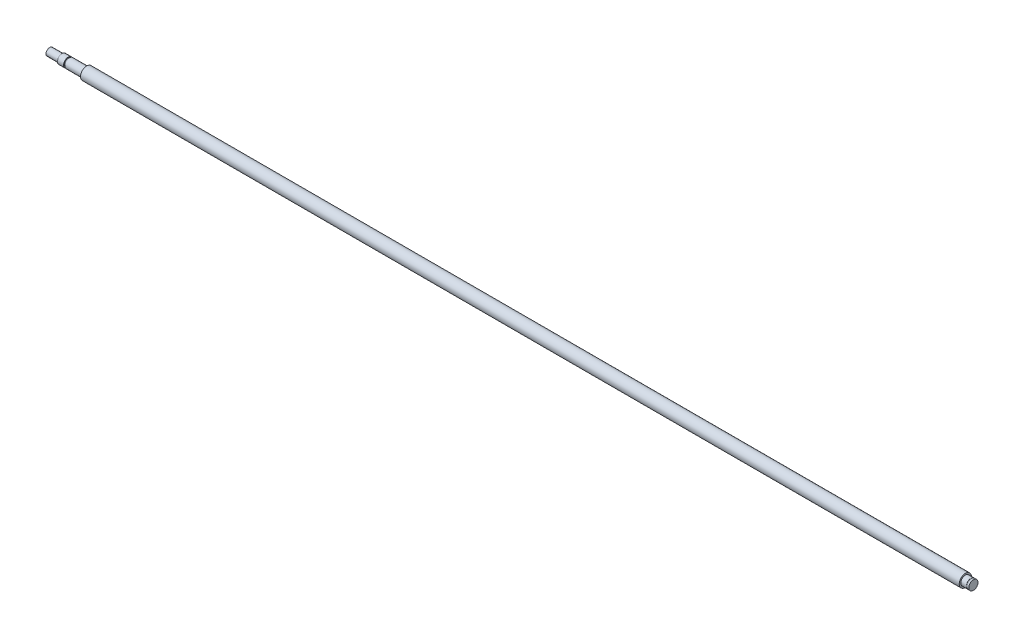
ISO-10303-21;
HEADER;
FILE_DESCRIPTION(('STEP AP214'),'2;1');
FILE_NAME('part.step','',(''),(''),'','','');
FILE_SCHEMA(('AUTOMOTIVE_DESIGN { 1 0 10303 214 1 1 1 1 }'));
ENDSEC;
DATA;
#1=APPLICATION_CONTEXT('core data for automotive mechanical design processes');
#2=APPLICATION_PROTOCOL_DEFINITION('international standard','automotive_design',2000,#1);
#3=PRODUCT_CONTEXT('',#1,'mechanical');
#4=PRODUCT('Part','Part','',(#3));
#5=PRODUCT_RELATED_PRODUCT_CATEGORY('part','',(#4));
#6=PRODUCT_DEFINITION_FORMATION('','',#4);
#7=PRODUCT_DEFINITION_CONTEXT('part definition',#1,'design');
#8=PRODUCT_DEFINITION('design','',#6,#7);
#9=PRODUCT_DEFINITION_SHAPE('','',#8);
#10=(LENGTH_UNIT() NAMED_UNIT(*) SI_UNIT(.MILLI.,.METRE.));
#11=(NAMED_UNIT(*) PLANE_ANGLE_UNIT() SI_UNIT($,.RADIAN.));
#12=(NAMED_UNIT(*) SI_UNIT($,.STERADIAN.) SOLID_ANGLE_UNIT());
#13=UNCERTAINTY_MEASURE_WITH_UNIT(LENGTH_MEASURE(1.E-05),#10,'distance_accuracy_value','');
#14=(GEOMETRIC_REPRESENTATION_CONTEXT(3) GLOBAL_UNCERTAINTY_ASSIGNED_CONTEXT((#13)) GLOBAL_UNIT_ASSIGNED_CONTEXT((#10,
#11,#12)) REPRESENTATION_CONTEXT('',''));
#15=CARTESIAN_POINT('',(0.,0.,0.));
#16=DIRECTION('',(0.,0.,1.));
#17=DIRECTION('',(1.,0.,0.));
#18=AXIS2_PLACEMENT_3D('',#15,#16,#17);
#19=CARTESIAN_POINT('',(-60.,6.,0.));
#20=DIRECTION('',(1.,0.,0.));
#21=DIRECTION('',(0.,0.,-1.));
#22=AXIS2_PLACEMENT_3D('',#19,#20,#21);
#23=PLANE('',#22);
#24=CARTESIAN_POINT('',(-60.,0.,0.));
#25=DIRECTION('',(-1.,0.,0.));
#26=DIRECTION('',(0.,0.,1.));
#27=AXIS2_PLACEMENT_3D('',#24,#25,#26);
#28=CIRCLE('',#27,6.);
#29=CARTESIAN_POINT('',(-60.,0.,6.));
#30=VERTEX_POINT('',#29);
#31=EDGE_CURVE('E104',#30,#30,#28,.T.);
#32=ORIENTED_EDGE('',*,*,#31,.T.);
#33=EDGE_LOOP('',(#32));
#34=FACE_BOUND('',#33,.T.);
#35=ADVANCED_FACE('F37',(#34),#23,.F.);
#36=CARTESIAN_POINT('',(1440.,0.,0.));
#37=DIRECTION('',(-1.,0.,0.));
#38=DIRECTION('',(0.,0.,1.));
#39=AXIS2_PLACEMENT_3D('',#36,#37,#38);
#40=PLANE('',#39);
#41=CARTESIAN_POINT('',(1440.,0.,0.));
#42=DIRECTION('',(-1.,0.,0.));
#43=DIRECTION('',(0.,0.,1.));
#44=AXIS2_PLACEMENT_3D('',#41,#42,#43);
#45=CIRCLE('',#44,7.50000000000018);
#46=CARTESIAN_POINT('',(1440.,0.,7.50000000000018));
#47=VERTEX_POINT('',#46);
#48=EDGE_CURVE('E10',#47,#47,#45,.T.);
#49=ORIENTED_EDGE('',*,*,#48,.F.);
#50=EDGE_LOOP('',(#49));
#51=FACE_BOUND('',#50,.T.);
#52=ADVANCED_FACE('F195',(#51),#40,.F.);
#53=CARTESIAN_POINT('',(-60.,0.,0.));
#54=DIRECTION('',(-1.,0.,0.));
#55=DIRECTION('',(0.,0.,1.));
#56=AXIS2_PLACEMENT_3D('',#53,#54,#55);
#57=CYLINDRICAL_SURFACE('',#56,7.50000000000018);
#58=CARTESIAN_POINT('',(1437.15,0.,0.));
#59=DIRECTION('',(-1.,0.,0.));
#60=DIRECTION('',(0.,0.,1.));
#61=AXIS2_PLACEMENT_3D('',#58,#59,#60);
#62=CIRCLE('',#61,7.50000000000018);
#63=CARTESIAN_POINT('',(1437.15,0.,7.50000000000018));
#64=VERTEX_POINT('',#63);
#65=EDGE_CURVE('E44',#64,#64,#62,.T.);
#66=ORIENTED_EDGE('',*,*,#65,.F.);
#67=EDGE_LOOP('',(#66));
#68=FACE_BOUND('',#67,.T.);
#69=ORIENTED_EDGE('',*,*,#48,.T.);
#70=EDGE_LOOP('',(#69));
#71=FACE_BOUND('',#70,.T.);
#72=ADVANCED_FACE('F190',(#68,#71),#57,.T.);
#73=CARTESIAN_POINT('',(1437.15,7.50000000000018,0.));
#74=DIRECTION('',(1.,0.,0.));
#75=DIRECTION('',(0.,0.,-1.));
#76=AXIS2_PLACEMENT_3D('',#73,#74,#75);
#77=PLANE('',#76);
#78=CARTESIAN_POINT('',(1437.15,0.,0.));
#79=DIRECTION('',(-1.,0.,0.));
#80=DIRECTION('',(0.,0.,1.));
#81=AXIS2_PLACEMENT_3D('',#78,#79,#80);
#82=CIRCLE('',#81,7.15000000000018);
#83=CARTESIAN_POINT('',(1437.15,0.,7.15000000000018));
#84=VERTEX_POINT('',#83);
#85=EDGE_CURVE('E49',#84,#84,#82,.T.);
#86=ORIENTED_EDGE('',*,*,#85,.F.);
#87=EDGE_LOOP('',(#86));
#88=FACE_BOUND('',#87,.T.);
#89=ORIENTED_EDGE('',*,*,#65,.T.);
#90=EDGE_LOOP('',(#89));
#91=FACE_BOUND('',#90,.T.);
#92=ADVANCED_FACE('F185',(#88,#91),#77,.F.);
#93=CARTESIAN_POINT('',(-60.,0.,0.));
#94=DIRECTION('',(-1.,0.,0.));
#95=DIRECTION('',(0.,0.,1.));
#96=AXIS2_PLACEMENT_3D('',#93,#94,#95);
#97=CYLINDRICAL_SURFACE('',#96,7.15000000000018);
#98=CARTESIAN_POINT('',(1436.,0.,0.));
#99=DIRECTION('',(-1.,0.,0.));
#100=DIRECTION('',(0.,0.,1.));
#101=AXIS2_PLACEMENT_3D('',#98,#99,#100);
#102=CIRCLE('',#101,7.15000000000018);
#103=CARTESIAN_POINT('',(1436.,0.,7.15000000000018));
#104=VERTEX_POINT('',#103);
#105=EDGE_CURVE('E54',#104,#104,#102,.T.);
#106=ORIENTED_EDGE('',*,*,#105,.F.);
#107=EDGE_LOOP('',(#106));
#108=FACE_BOUND('',#107,.T.);
#109=ORIENTED_EDGE('',*,*,#85,.T.);
#110=EDGE_LOOP('',(#109));
#111=FACE_BOUND('',#110,.T.);
#112=ADVANCED_FACE('F179',(#108,#111),#97,.T.);
#113=CARTESIAN_POINT('',(1436.,7.15000000000018,0.));
#114=DIRECTION('',(-1.,0.,0.));
#115=DIRECTION('',(0.,0.,1.));
#116=AXIS2_PLACEMENT_3D('',#113,#114,#115);
#117=PLANE('',#116);
#118=CARTESIAN_POINT('',(1436.,0.,0.));
#119=DIRECTION('',(-1.,0.,0.));
#120=DIRECTION('',(0.,0.,1.));
#121=AXIS2_PLACEMENT_3D('',#118,#119,#120);
#122=CIRCLE('',#121,7.50000000000018);
#123=CARTESIAN_POINT('',(1436.,0.,7.50000000000018));
#124=VERTEX_POINT('',#123);
#125=EDGE_CURVE('E60',#124,#124,#122,.T.);
#126=ORIENTED_EDGE('',*,*,#125,.F.);
#127=EDGE_LOOP('',(#126));
#128=FACE_BOUND('',#127,.T.);
#129=ORIENTED_EDGE('',*,*,#105,.T.);
#130=EDGE_LOOP('',(#129));
#131=FACE_BOUND('',#130,.T.);
#132=ADVANCED_FACE('F173',(#128,#131),#117,.F.);
#133=CARTESIAN_POINT('',(-60.,0.,0.));
#134=DIRECTION('',(-1.,0.,0.));
#135=DIRECTION('',(0.,0.,1.));
#136=AXIS2_PLACEMENT_3D('',#133,#134,#135);
#137=CYLINDRICAL_SURFACE('',#136,7.50000000000018);
#138=CARTESIAN_POINT('',(1427.,0.,0.));
#139=DIRECTION('',(-1.,0.,0.));
#140=DIRECTION('',(0.,0.,1.));
#141=AXIS2_PLACEMENT_3D('',#138,#139,#140);
#142=CIRCLE('',#141,7.50000000000018);
#143=CARTESIAN_POINT('',(1427.,0.,7.50000000000018));
#144=VERTEX_POINT('',#143);
#145=EDGE_CURVE('E64',#144,#144,#142,.T.);
#146=ORIENTED_EDGE('',*,*,#145,.F.);
#147=EDGE_LOOP('',(#146));
#148=FACE_BOUND('',#147,.T.);
#149=ORIENTED_EDGE('',*,*,#125,.T.);
#150=EDGE_LOOP('',(#149));
#151=FACE_BOUND('',#150,.T.);
#152=ADVANCED_FACE('F167',(#148,#151),#137,.T.);
#153=CARTESIAN_POINT('',(1427.,7.50000000000018,0.));
#154=DIRECTION('',(-1.,0.,0.));
#155=DIRECTION('',(0.,0.,1.));
#156=AXIS2_PLACEMENT_3D('',#153,#154,#155);
#157=PLANE('',#156);
#158=CARTESIAN_POINT('',(1427.,0.,0.));
#159=DIRECTION('',(-1.,0.,0.));
#160=DIRECTION('',(0.,0.,1.));
#161=AXIS2_PLACEMENT_3D('',#158,#159,#160);
#162=CIRCLE('',#161,10.);
#163=CARTESIAN_POINT('',(1427.,0.,10.));
#164=VERTEX_POINT('',#163);
#165=EDGE_CURVE('E68',#164,#164,#162,.T.);
#166=ORIENTED_EDGE('',*,*,#165,.F.);
#167=EDGE_LOOP('',(#166));
#168=FACE_BOUND('',#167,.T.);
#169=ORIENTED_EDGE('',*,*,#145,.T.);
#170=EDGE_LOOP('',(#169));
#171=FACE_BOUND('',#170,.T.);
#172=ADVANCED_FACE('F161',(#168,#171),#157,.F.);
#173=CARTESIAN_POINT('',(-60.,0.,0.));
#174=DIRECTION('',(-1.,0.,0.));
#175=DIRECTION('',(0.,0.,1.));
#176=AXIS2_PLACEMENT_3D('',#173,#174,#175);
#177=CYLINDRICAL_SURFACE('',#176,9.99999999999991);
#178=CARTESIAN_POINT('',(0.,0.,0.));
#179=DIRECTION('',(-1.,0.,0.));
#180=DIRECTION('',(0.,0.,1.));
#181=AXIS2_PLACEMENT_3D('',#178,#179,#180);
#182=CIRCLE('',#181,9.99999999999982);
#183=CARTESIAN_POINT('',(0.,0.,9.99999999999982));
#184=VERTEX_POINT('',#183);
#185=EDGE_CURVE('E72',#184,#184,#182,.T.);
#186=ORIENTED_EDGE('',*,*,#185,.F.);
#187=EDGE_LOOP('',(#186));
#188=FACE_BOUND('',#187,.T.);
#189=ORIENTED_EDGE('',*,*,#165,.T.);
#190=EDGE_LOOP('',(#189));
#191=FACE_BOUND('',#190,.T.);
#192=ADVANCED_FACE('F155',(#188,#191),#177,.T.);
#193=CARTESIAN_POINT('',(0.,9.99999999999982,0.));
#194=DIRECTION('',(1.,0.,0.));
#195=DIRECTION('',(0.,0.,-1.));
#196=AXIS2_PLACEMENT_3D('',#193,#194,#195);
#197=PLANE('',#196);
#198=CARTESIAN_POINT('',(0.,0.,0.));
#199=DIRECTION('',(-1.,0.,0.));
#200=DIRECTION('',(0.,0.,1.));
#201=AXIS2_PLACEMENT_3D('',#198,#199,#200);
#202=CIRCLE('',#201,7.5);
#203=CARTESIAN_POINT('',(0.,0.,7.5));
#204=VERTEX_POINT('',#203);
#205=EDGE_CURVE('E76',#204,#204,#202,.T.);
#206=ORIENTED_EDGE('',*,*,#205,.F.);
#207=EDGE_LOOP('',(#206));
#208=FACE_BOUND('',#207,.T.);
#209=ORIENTED_EDGE('',*,*,#185,.T.);
#210=EDGE_LOOP('',(#209));
#211=FACE_BOUND('',#210,.T.);
#212=ADVANCED_FACE('F149',(#208,#211),#197,.F.);
#213=CARTESIAN_POINT('',(-60.,0.,0.));
#214=DIRECTION('',(-1.,0.,0.));
#215=DIRECTION('',(0.,0.,1.));
#216=AXIS2_PLACEMENT_3D('',#213,#214,#215);
#217=CYLINDRICAL_SURFACE('',#216,7.5);
#218=CARTESIAN_POINT('',(-28.,0.,0.));
#219=DIRECTION('',(-1.,0.,0.));
#220=DIRECTION('',(0.,0.,1.));
#221=AXIS2_PLACEMENT_3D('',#218,#219,#220);
#222=CIRCLE('',#221,7.5);
#223=CARTESIAN_POINT('',(-28.,0.,7.5));
#224=VERTEX_POINT('',#223);
#225=EDGE_CURVE('E80',#224,#224,#222,.T.);
#226=ORIENTED_EDGE('',*,*,#225,.F.);
#227=EDGE_LOOP('',(#226));
#228=FACE_BOUND('',#227,.T.);
#229=ORIENTED_EDGE('',*,*,#205,.T.);
#230=EDGE_LOOP('',(#229));
#231=FACE_BOUND('',#230,.T.);
#232=ADVANCED_FACE('F143',(#228,#231),#217,.T.);
#233=CARTESIAN_POINT('',(-28.,7.5,0.));
#234=DIRECTION('',(1.,0.,0.));
#235=DIRECTION('',(0.,0.,-1.));
#236=AXIS2_PLACEMENT_3D('',#233,#234,#235);
#237=PLANE('',#236);
#238=CARTESIAN_POINT('',(-28.,0.,0.));
#239=DIRECTION('',(-1.,0.,0.));
#240=DIRECTION('',(0.,0.,1.));
#241=AXIS2_PLACEMENT_3D('',#238,#239,#240);
#242=CIRCLE('',#241,6.);
#243=CARTESIAN_POINT('',(-28.,0.,6.));
#244=VERTEX_POINT('',#243);
#245=EDGE_CURVE('E84',#244,#244,#242,.T.);
#246=ORIENTED_EDGE('',*,*,#245,.F.);
#247=EDGE_LOOP('',(#246));
#248=FACE_BOUND('',#247,.T.);
#249=ORIENTED_EDGE('',*,*,#225,.T.);
#250=EDGE_LOOP('',(#249));
#251=FACE_BOUND('',#250,.T.);
#252=ADVANCED_FACE('F137',(#248,#251),#237,.F.);
#253=CARTESIAN_POINT('',(-60.,0.,0.));
#254=DIRECTION('',(-1.,0.,0.));
#255=DIRECTION('',(0.,0.,1.));
#256=AXIS2_PLACEMENT_3D('',#253,#254,#255);
#257=CYLINDRICAL_SURFACE('',#256,6.);
#258=CARTESIAN_POINT('',(-30.,0.,0.));
#259=DIRECTION('',(-1.,0.,0.));
#260=DIRECTION('',(0.,0.,1.));
#261=AXIS2_PLACEMENT_3D('',#258,#259,#260);
#262=CIRCLE('',#261,6.);
#263=CARTESIAN_POINT('',(-30.,0.,6.));
#264=VERTEX_POINT('',#263);
#265=EDGE_CURVE('E88',#264,#264,#262,.T.);
#266=ORIENTED_EDGE('',*,*,#265,.F.);
#267=EDGE_LOOP('',(#266));
#268=FACE_BOUND('',#267,.T.);
#269=ORIENTED_EDGE('',*,*,#245,.T.);
#270=EDGE_LOOP('',(#269));
#271=FACE_BOUND('',#270,.T.);
#272=ADVANCED_FACE('F131',(#268,#271),#257,.T.);
#273=CARTESIAN_POINT('',(-30.,6.,0.));
#274=DIRECTION('',(-1.,0.,0.));
#275=DIRECTION('',(0.,0.,1.));
#276=AXIS2_PLACEMENT_3D('',#273,#274,#275);
#277=PLANE('',#276);
#278=CARTESIAN_POINT('',(-30.,0.,0.));
#279=DIRECTION('',(-1.,0.,0.));
#280=DIRECTION('',(0.,0.,1.));
#281=AXIS2_PLACEMENT_3D('',#278,#279,#280);
#282=CIRCLE('',#281,7.5);
#283=CARTESIAN_POINT('',(-30.,0.,7.5));
#284=VERTEX_POINT('',#283);
#285=EDGE_CURVE('E92',#284,#284,#282,.T.);
#286=ORIENTED_EDGE('',*,*,#285,.F.);
#287=EDGE_LOOP('',(#286));
#288=FACE_BOUND('',#287,.T.);
#289=ORIENTED_EDGE('',*,*,#265,.T.);
#290=EDGE_LOOP('',(#289));
#291=FACE_BOUND('',#290,.T.);
#292=ADVANCED_FACE('F125',(#288,#291),#277,.F.);
#293=CARTESIAN_POINT('',(-60.,0.,0.));
#294=DIRECTION('',(-1.,0.,0.));
#295=DIRECTION('',(0.,0.,1.));
#296=AXIS2_PLACEMENT_3D('',#293,#294,#295);
#297=CYLINDRICAL_SURFACE('',#296,7.5);
#298=CARTESIAN_POINT('',(-40.,0.,0.));
#299=DIRECTION('',(-1.,0.,0.));
#300=DIRECTION('',(0.,0.,1.));
#301=AXIS2_PLACEMENT_3D('',#298,#299,#300);
#302=CIRCLE('',#301,7.5);
#303=CARTESIAN_POINT('',(-40.,0.,7.5));
#304=VERTEX_POINT('',#303);
#305=EDGE_CURVE('E96',#304,#304,#302,.T.);
#306=ORIENTED_EDGE('',*,*,#305,.F.);
#307=EDGE_LOOP('',(#306));
#308=FACE_BOUND('',#307,.T.);
#309=ORIENTED_EDGE('',*,*,#285,.T.);
#310=EDGE_LOOP('',(#309));
#311=FACE_BOUND('',#310,.T.);
#312=ADVANCED_FACE('F119',(#308,#311),#297,.T.);
#313=CARTESIAN_POINT('',(-40.,7.5,0.));
#314=DIRECTION('',(1.,0.,0.));
#315=DIRECTION('',(0.,0.,-1.));
#316=AXIS2_PLACEMENT_3D('',#313,#314,#315);
#317=PLANE('',#316);
#318=CARTESIAN_POINT('',(-40.,0.,0.));
#319=DIRECTION('',(-1.,0.,0.));
#320=DIRECTION('',(0.,0.,1.));
#321=AXIS2_PLACEMENT_3D('',#318,#319,#320);
#322=CIRCLE('',#321,6.);
#323=CARTESIAN_POINT('',(-40.,0.,6.));
#324=VERTEX_POINT('',#323);
#325=EDGE_CURVE('E100',#324,#324,#322,.T.);
#326=ORIENTED_EDGE('',*,*,#325,.F.);
#327=EDGE_LOOP('',(#326));
#328=FACE_BOUND('',#327,.T.);
#329=ORIENTED_EDGE('',*,*,#305,.T.);
#330=EDGE_LOOP('',(#329));
#331=FACE_BOUND('',#330,.T.);
#332=ADVANCED_FACE('F113',(#328,#331),#317,.F.);
#333=CARTESIAN_POINT('',(-60.,0.,0.));
#334=DIRECTION('',(-1.,0.,0.));
#335=DIRECTION('',(0.,0.,1.));
#336=AXIS2_PLACEMENT_3D('',#333,#334,#335);
#337=CYLINDRICAL_SURFACE('',#336,6.);
#338=ORIENTED_EDGE('',*,*,#31,.F.);
#339=EDGE_LOOP('',(#338));
#340=FACE_BOUND('',#339,.T.);
#341=ORIENTED_EDGE('',*,*,#325,.T.);
#342=EDGE_LOOP('',(#341));
#343=FACE_BOUND('',#342,.T.);
#344=ADVANCED_FACE('F110',(#340,#343),#337,.T.);
#345=CLOSED_SHELL('',(#35,#52,#72,#92,#112,#132,#152,#172,#192,#212,#232,#252,#272,#292,#312,
#332,#344));
#346=MANIFOLD_SOLID_BREP('B2',#345);
#347=ADVANCED_BREP_SHAPE_REPRESENTATION('',(#18,#346),#14);
#348=SHAPE_DEFINITION_REPRESENTATION(#9,#347);
ENDSEC;
END-ISO-10303-21;
